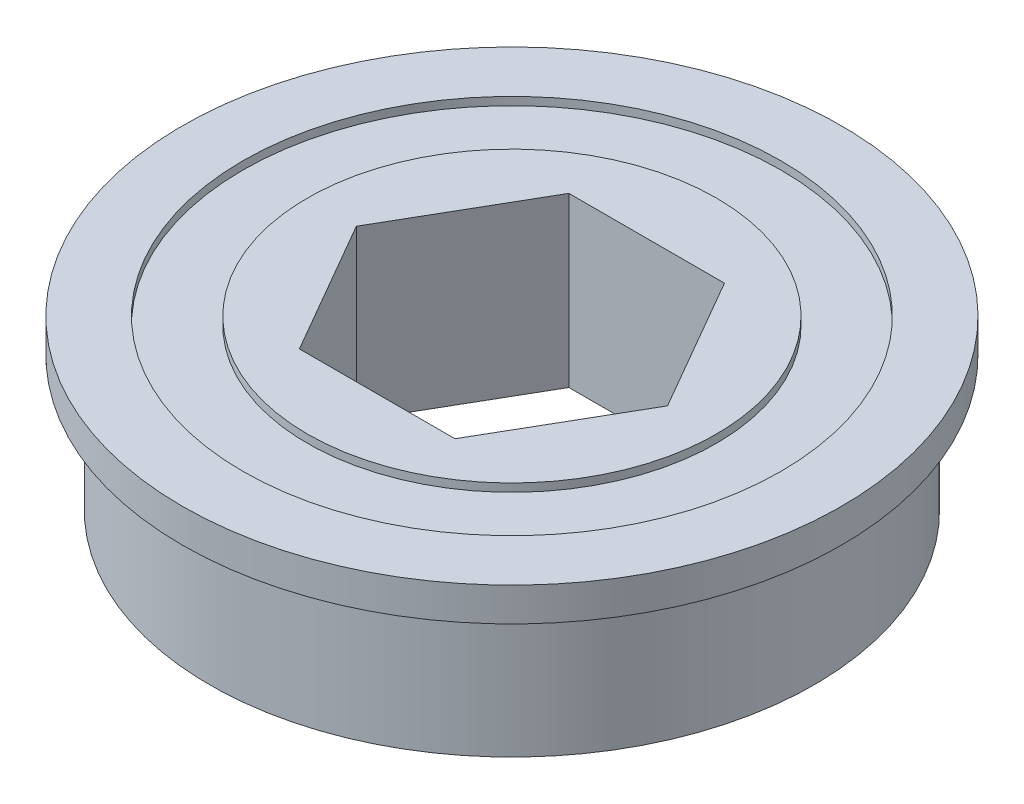
ISO-10303-21;
HEADER;
FILE_DESCRIPTION(('STEP AP214'),'2;1');
FILE_NAME('part.step','',(''),(''),'','','');
FILE_SCHEMA(('AUTOMOTIVE_DESIGN { 1 0 10303 214 1 1 1 1 }'));
ENDSEC;
DATA;
#1=APPLICATION_CONTEXT('core data for automotive mechanical design processes');
#2=APPLICATION_PROTOCOL_DEFINITION('international standard','automotive_design',2000,#1);
#3=PRODUCT_CONTEXT('',#1,'mechanical');
#4=PRODUCT('Part','Part','',(#3));
#5=PRODUCT_RELATED_PRODUCT_CATEGORY('part','',(#4));
#6=PRODUCT_DEFINITION_FORMATION('','',#4);
#7=PRODUCT_DEFINITION_CONTEXT('part definition',#1,'design');
#8=PRODUCT_DEFINITION('design','',#6,#7);
#9=PRODUCT_DEFINITION_SHAPE('','',#8);
#10=(LENGTH_UNIT() NAMED_UNIT(*) SI_UNIT(.MILLI.,.METRE.));
#11=(NAMED_UNIT(*) PLANE_ANGLE_UNIT() SI_UNIT($,.RADIAN.));
#12=(NAMED_UNIT(*) SI_UNIT($,.STERADIAN.) SOLID_ANGLE_UNIT());
#13=UNCERTAINTY_MEASURE_WITH_UNIT(LENGTH_MEASURE(1.E-05),#10,'distance_accuracy_value','');
#14=(GEOMETRIC_REPRESENTATION_CONTEXT(3) GLOBAL_UNCERTAINTY_ASSIGNED_CONTEXT((#13)) GLOBAL_UNIT_ASSIGNED_CONTEXT((#10,
#11,#12)) REPRESENTATION_CONTEXT('',''));
#15=CARTESIAN_POINT('',(0.,0.,0.));
#16=DIRECTION('',(0.,0.,1.));
#17=DIRECTION('',(1.,0.,0.));
#18=AXIS2_PLACEMENT_3D('',#15,#16,#17);
#19=CARTESIAN_POINT('',(0.,6.1,0.));
#20=DIRECTION('',(0.,1.,0.));
#21=DIRECTION('',(0.,0.,1.));
#22=AXIS2_PLACEMENT_3D('',#19,#20,#21);
#23=TOROIDAL_SURFACE('',#22,14.2748,0.25);
#24=CARTESIAN_POINT('',(0.,5.975,0.));
#25=DIRECTION('',(0.,-1.,0.));
#26=DIRECTION('',(0.,0.,-1.));
#27=AXIS2_PLACEMENT_3D('',#24,#25,#26);
#28=CIRCLE('',#27,14.0582936490539);
#29=CARTESIAN_POINT('',(0.,5.975,-14.0582936490539));
#30=VERTEX_POINT('',#29);
#31=EDGE_CURVE('E157',#30,#30,#28,.T.);
#32=ORIENTED_EDGE('',*,*,#31,.F.);
#33=EDGE_LOOP('',(#32));
#34=FACE_BOUND('',#33,.T.);
#35=CARTESIAN_POINT('',(0.,6.35,0.));
#36=DIRECTION('',(0.,1.,0.));
#37=DIRECTION('',(0.,0.,1.));
#38=AXIS2_PLACEMENT_3D('',#35,#36,#37);
#39=CIRCLE('',#38,14.2748);
#40=CARTESIAN_POINT('',(0.,6.35,14.2748));
#41=VERTEX_POINT('',#40);
#42=EDGE_CURVE('E169',#41,#41,#39,.T.);
#43=ORIENTED_EDGE('',*,*,#42,.F.);
#44=EDGE_LOOP('',(#43));
#45=FACE_BOUND('',#44,.T.);
#46=ADVANCED_FACE('F32',(#34,#45),#23,.F.);
#47=CARTESIAN_POINT('',(15.5575,6.35,0.));
#48=DIRECTION('',(0.,-1.,0.));
#49=DIRECTION('',(0.,0.,-1.));
#50=AXIS2_PLACEMENT_3D('',#47,#48,#49);
#51=PLANE('',#50);
#52=ORIENTED_EDGE('',*,*,#42,.T.);
#53=EDGE_LOOP('',(#52));
#54=FACE_BOUND('',#53,.T.);
#55=CARTESIAN_POINT('',(0.,6.35,0.));
#56=DIRECTION('',(0.,1.,0.));
#57=DIRECTION('',(0.,0.,1.));
#58=AXIS2_PLACEMENT_3D('',#55,#56,#57);
#59=CIRCLE('',#58,15.5575);
#60=CARTESIAN_POINT('',(0.,6.35,15.5575));
#61=VERTEX_POINT('',#60);
#62=EDGE_CURVE('E166',#61,#61,#59,.T.);
#63=ORIENTED_EDGE('',*,*,#62,.F.);
#64=EDGE_LOOP('',(#63));
#65=FACE_BOUND('',#64,.T.);
#66=ADVANCED_FACE('F209',(#54,#65),#51,.T.);
#67=CARTESIAN_POINT('',(0.,5.974975,0.));
#68=DIRECTION('',(0.,1.,0.));
#69=DIRECTION('',(0.,0.,1.));
#70=AXIS2_PLACEMENT_3D('',#67,#68,#69);
#71=CYLINDRICAL_SURFACE('',#70,15.5575);
#72=ORIENTED_EDGE('',*,*,#62,.T.);
#73=EDGE_LOOP('',(#72));
#74=FACE_BOUND('',#73,.T.);
#75=CARTESIAN_POINT('',(0.,7.9375,0.));
#76=DIRECTION('',(0.,1.,0.));
#77=DIRECTION('',(0.,0.,1.));
#78=AXIS2_PLACEMENT_3D('',#75,#76,#77);
#79=CIRCLE('',#78,15.5575);
#80=CARTESIAN_POINT('',(0.,7.9375,15.5575));
#81=VERTEX_POINT('',#80);
#82=EDGE_CURVE('E163',#81,#81,#79,.T.);
#83=ORIENTED_EDGE('',*,*,#82,.F.);
#84=EDGE_LOOP('',(#83));
#85=FACE_BOUND('',#84,.T.);
#86=ADVANCED_FACE('F214',(#74,#85),#71,.T.);
#87=CARTESIAN_POINT('',(0.,7.9375,0.));
#88=DIRECTION('',(0.,1.,0.));
#89=DIRECTION('',(0.,0.,1.));
#90=AXIS2_PLACEMENT_3D('',#87,#88,#89);
#91=PLANE('',#90);
#92=CARTESIAN_POINT('',(0.,7.9375,0.));
#93=DIRECTION('',(0.,1.,0.));
#94=DIRECTION('',(0.,0.,-1.));
#95=AXIS2_PLACEMENT_3D('',#92,#93,#94);
#96=CIRCLE('',#95,12.7);
#97=CARTESIAN_POINT('',(0.,7.9375,-12.7));
#98=VERTEX_POINT('',#97);
#99=EDGE_CURVE('E139',#98,#98,#96,.T.);
#100=ORIENTED_EDGE('',*,*,#99,.F.);
#101=EDGE_LOOP('',(#100));
#102=FACE_BOUND('',#101,.T.);
#103=ORIENTED_EDGE('',*,*,#82,.T.);
#104=EDGE_LOOP('',(#103));
#105=FACE_BOUND('',#104,.T.);
#106=ADVANCED_FACE('F203',(#102,#105),#91,.T.);
#107=CARTESIAN_POINT('',(0.,5.975,0.));
#108=DIRECTION('',(0.,-1.,0.));
#109=DIRECTION('',(0.,0.,-1.));
#110=AXIS2_PLACEMENT_3D('',#107,#108,#109);
#111=CONICAL_SURFACE('',#110,14.0582936490539,0.523598775598302);
#112=CARTESIAN_POINT('',(0.,5.6,0.));
#113=DIRECTION('',(0.,-1.,0.));
#114=DIRECTION('',(0.,0.,-1.));
#115=AXIS2_PLACEMENT_3D('',#112,#113,#114);
#116=CIRCLE('',#115,14.2748);
#117=CARTESIAN_POINT('',(0.,5.6,-14.2748));
#118=VERTEX_POINT('',#117);
#119=EDGE_CURVE('E160',#118,#118,#116,.T.);
#120=ORIENTED_EDGE('',*,*,#119,.F.);
#121=EDGE_LOOP('',(#120));
#122=FACE_BOUND('',#121,.T.);
#123=ORIENTED_EDGE('',*,*,#31,.T.);
#124=EDGE_LOOP('',(#123));
#125=FACE_BOUND('',#124,.T.);
#126=ADVANCED_FACE('F197',(#122,#125),#111,.T.);
#127=CARTESIAN_POINT('',(0.,0.,0.));
#128=DIRECTION('',(0.,1.,0.));
#129=DIRECTION('',(0.,0.,1.));
#130=AXIS2_PLACEMENT_3D('',#127,#128,#129);
#131=CYLINDRICAL_SURFACE('',#130,14.2748);
#132=CARTESIAN_POINT('',(0.,0.,0.));
#133=DIRECTION('',(0.,-1.,0.));
#134=DIRECTION('',(0.,0.,-1.));
#135=AXIS2_PLACEMENT_3D('',#132,#133,#134);
#136=CIRCLE('',#135,14.2748);
#137=CARTESIAN_POINT('',(0.,0.,-14.2748));
#138=VERTEX_POINT('',#137);
#139=EDGE_CURVE('E152',#138,#138,#136,.T.);
#140=ORIENTED_EDGE('',*,*,#139,.F.);
#141=EDGE_LOOP('',(#140));
#142=FACE_BOUND('',#141,.T.);
#143=ORIENTED_EDGE('',*,*,#119,.T.);
#144=EDGE_LOOP('',(#143));
#145=FACE_BOUND('',#144,.T.);
#146=ADVANCED_FACE('F191',(#142,#145),#131,.T.);
#147=CARTESIAN_POINT('',(0.,0.,0.));
#148=DIRECTION('',(0.,-1.,0.));
#149=DIRECTION('',(0.,0.,-1.));
#150=AXIS2_PLACEMENT_3D('',#147,#148,#149);
#151=PLANE('',#150);
#152=CARTESIAN_POINT('',(0.,0.,0.));
#153=DIRECTION('',(0.,-1.,0.));
#154=DIRECTION('',(0.,0.,1.));
#155=AXIS2_PLACEMENT_3D('',#152,#153,#154);
#156=CIRCLE('',#155,12.7);
#157=CARTESIAN_POINT('',(0.,0.,12.7));
#158=VERTEX_POINT('',#157);
#159=EDGE_CURVE('E148',#158,#158,#156,.T.);
#160=ORIENTED_EDGE('',*,*,#159,.F.);
#161=EDGE_LOOP('',(#160));
#162=FACE_BOUND('',#161,.T.);
#163=ORIENTED_EDGE('',*,*,#139,.T.);
#164=EDGE_LOOP('',(#163));
#165=FACE_BOUND('',#164,.T.);
#166=ADVANCED_FACE('F185',(#162,#165),#151,.T.);
#167=CARTESIAN_POINT('',(0.,0.381,0.));
#168=DIRECTION('',(0.,-1.,0.));
#169=DIRECTION('',(0.,0.,-1.));
#170=AXIS2_PLACEMENT_3D('',#167,#168,#169);
#171=CYLINDRICAL_SURFACE('',#170,12.7);
#172=CARTESIAN_POINT('',(0.,0.381,0.));
#173=DIRECTION('',(0.,-1.,0.));
#174=DIRECTION('',(0.,0.,1.));
#175=AXIS2_PLACEMENT_3D('',#172,#173,#174);
#176=CIRCLE('',#175,12.7);
#177=CARTESIAN_POINT('',(0.,0.381,12.7));
#178=VERTEX_POINT('',#177);
#179=EDGE_CURVE('E149',#178,#178,#176,.T.);
#180=ORIENTED_EDGE('',*,*,#179,.F.);
#181=EDGE_LOOP('',(#180));
#182=FACE_BOUND('',#181,.T.);
#183=ORIENTED_EDGE('',*,*,#159,.T.);
#184=EDGE_LOOP('',(#183));
#185=FACE_BOUND('',#184,.T.);
#186=ADVANCED_FACE('F179',(#182,#185),#171,.F.);
#187=CARTESIAN_POINT('',(0.,0.381,0.));
#188=DIRECTION('',(0.,1.,0.));
#189=DIRECTION('',(0.,0.,1.));
#190=AXIS2_PLACEMENT_3D('',#187,#188,#189);
#191=PLANE('',#190);
#192=CARTESIAN_POINT('',(0.,0.381,0.));
#193=DIRECTION('',(0.,1.,0.));
#194=DIRECTION('',(0.,0.,1.));
#195=AXIS2_PLACEMENT_3D('',#192,#193,#194);
#196=CIRCLE('',#195,9.652);
#197=CARTESIAN_POINT('',(0.,0.381,9.652));
#198=VERTEX_POINT('',#197);
#199=EDGE_CURVE('E39',#198,#198,#196,.F.);
#200=ORIENTED_EDGE('',*,*,#199,.F.);
#201=EDGE_LOOP('',(#200));
#202=FACE_BOUND('',#201,.T.);
#203=ORIENTED_EDGE('',*,*,#179,.T.);
#204=EDGE_LOOP('',(#203));
#205=FACE_BOUND('',#204,.T.);
#206=ADVANCED_FACE('F176',(#202,#205),#191,.F.);
#207=CARTESIAN_POINT('',(0.,0.,0.));
#208=DIRECTION('',(0.,1.,0.));
#209=DIRECTION('',(0.,0.,1.));
#210=AXIS2_PLACEMENT_3D('',#207,#208,#209);
#211=CYLINDRICAL_SURFACE('',#210,9.652);
#212=CARTESIAN_POINT('',(0.,0.,0.));
#213=DIRECTION('',(0.,-1.,0.));
#214=DIRECTION('',(0.,0.,-1.));
#215=AXIS2_PLACEMENT_3D('',#212,#213,#214);
#216=CIRCLE('',#215,9.652);
#217=CARTESIAN_POINT('',(0.,0.,-9.652));
#218=VERTEX_POINT('',#217);
#219=EDGE_CURVE('E143',#218,#218,#216,.T.);
#220=ORIENTED_EDGE('',*,*,#219,.F.);
#221=EDGE_LOOP('',(#220));
#222=FACE_BOUND('',#221,.T.);
#223=ORIENTED_EDGE('',*,*,#199,.T.);
#224=EDGE_LOOP('',(#223));
#225=FACE_BOUND('',#224,.T.);
#226=ADVANCED_FACE('F174',(#222,#225),#211,.T.);
#227=CARTESIAN_POINT('',(0.,0.,0.));
#228=DIRECTION('',(0.,-1.,0.));
#229=DIRECTION('',(0.,0.,-1.));
#230=AXIS2_PLACEMENT_3D('',#227,#228,#229);
#231=PLANE('',#230);
#232=DIRECTION('',(-0.5,0.,0.866025403784439));
#233=VECTOR('',#232,1.);
#234=CARTESIAN_POINT('',(-3.67194771204602,0.,-6.36));
#235=LINE('',#234,#233);
#236=CARTESIAN_POINT('',(-3.67194771204602,0.,-6.36));
#237=VERTEX_POINT('',#236);
#238=CARTESIAN_POINT('',(-7.34389542409204,0.,0.));
#239=VERTEX_POINT('',#238);
#240=EDGE_CURVE('E86',#237,#239,#235,.T.);
#241=ORIENTED_EDGE('',*,*,#240,.T.);
#242=DIRECTION('',(0.5,0.,0.866025403784439));
#243=VECTOR('',#242,1.);
#244=CARTESIAN_POINT('',(-7.34389542409204,0.,0.));
#245=LINE('',#244,#243);
#246=CARTESIAN_POINT('',(-3.67194771204602,0.,6.36));
#247=VERTEX_POINT('',#246);
#248=EDGE_CURVE('E95',#239,#247,#245,.T.);
#249=ORIENTED_EDGE('',*,*,#248,.T.);
#250=DIRECTION('',(1.,0.,0.));
#251=VECTOR('',#250,1.);
#252=CARTESIAN_POINT('',(-3.67194771204601,0.,6.36));
#253=LINE('',#252,#251);
#254=CARTESIAN_POINT('',(3.67194771204602,0.,6.36));
#255=VERTEX_POINT('',#254);
#256=EDGE_CURVE('E46',#247,#255,#253,.T.);
#257=ORIENTED_EDGE('',*,*,#256,.T.);
#258=DIRECTION('',(0.5,0.,-0.866025403784439));
#259=VECTOR('',#258,1.);
#260=CARTESIAN_POINT('',(3.67194771204602,0.,6.36));
#261=LINE('',#260,#259);
#262=CARTESIAN_POINT('',(7.34389542409204,0.,0.));
#263=VERTEX_POINT('',#262);
#264=EDGE_CURVE('E110',#255,#263,#261,.T.);
#265=ORIENTED_EDGE('',*,*,#264,.T.);
#266=DIRECTION('',(-0.5,0.,-0.866025403784439));
#267=VECTOR('',#266,1.);
#268=CARTESIAN_POINT('',(7.34389542409204,0.,0.));
#269=LINE('',#268,#267);
#270=CARTESIAN_POINT('',(3.67194771204602,0.,-6.36));
#271=VERTEX_POINT('',#270);
#272=EDGE_CURVE('E113',#263,#271,#269,.T.);
#273=ORIENTED_EDGE('',*,*,#272,.T.);
#274=DIRECTION('',(-1.,0.,0.));
#275=VECTOR('',#274,1.);
#276=CARTESIAN_POINT('',(3.67194771204602,0.,-6.36));
#277=LINE('',#276,#275);
#278=EDGE_CURVE('E92',#271,#237,#277,.T.);
#279=ORIENTED_EDGE('',*,*,#278,.T.);
#280=EDGE_LOOP('',(#241,#249,#257,#265,#273,#279));
#281=FACE_BOUND('',#280,.T.);
#282=ORIENTED_EDGE('',*,*,#219,.T.);
#283=EDGE_LOOP('',(#282));
#284=FACE_BOUND('',#283,.T.);
#285=ADVANCED_FACE('F99',(#281,#284),#231,.T.);
#286=CARTESIAN_POINT('',(0.,7.5565,0.));
#287=DIRECTION('',(0.,1.,0.));
#288=DIRECTION('',(0.,0.,1.));
#289=AXIS2_PLACEMENT_3D('',#286,#287,#288);
#290=CYLINDRICAL_SURFACE('',#289,12.7);
#291=CARTESIAN_POINT('',(0.,7.5565,0.));
#292=DIRECTION('',(0.,1.,0.));
#293=DIRECTION('',(0.,0.,-1.));
#294=AXIS2_PLACEMENT_3D('',#291,#292,#293);
#295=CIRCLE('',#294,12.7);
#296=CARTESIAN_POINT('',(0.,7.5565,-12.7));
#297=VERTEX_POINT('',#296);
#298=EDGE_CURVE('E140',#297,#297,#295,.T.);
#299=ORIENTED_EDGE('',*,*,#298,.F.);
#300=EDGE_LOOP('',(#299));
#301=FACE_BOUND('',#300,.T.);
#302=ORIENTED_EDGE('',*,*,#99,.T.);
#303=EDGE_LOOP('',(#302));
#304=FACE_BOUND('',#303,.T.);
#305=ADVANCED_FACE('F234',(#301,#304),#290,.F.);
#306=CARTESIAN_POINT('',(0.,7.5565,0.));
#307=DIRECTION('',(0.,-1.,0.));
#308=DIRECTION('',(0.,0.,-1.));
#309=AXIS2_PLACEMENT_3D('',#306,#307,#308);
#310=PLANE('',#309);
#311=CARTESIAN_POINT('',(0.,7.5565,0.));
#312=DIRECTION('',(0.,-1.,0.));
#313=DIRECTION('',(0.,0.,-1.));
#314=AXIS2_PLACEMENT_3D('',#311,#312,#313);
#315=CIRCLE('',#314,9.652);
#316=CARTESIAN_POINT('',(0.,7.5565,-9.652));
#317=VERTEX_POINT('',#316);
#318=EDGE_CURVE('E11',#317,#317,#315,.F.);
#319=ORIENTED_EDGE('',*,*,#318,.F.);
#320=EDGE_LOOP('',(#319));
#321=FACE_BOUND('',#320,.T.);
#322=ORIENTED_EDGE('',*,*,#298,.T.);
#323=EDGE_LOOP('',(#322));
#324=FACE_BOUND('',#323,.T.);
#325=ADVANCED_FACE('F237',(#321,#324),#310,.F.);
#326=CARTESIAN_POINT('',(0.,7.9375,0.));
#327=DIRECTION('',(0.,-1.,0.));
#328=DIRECTION('',(0.,0.,-1.));
#329=AXIS2_PLACEMENT_3D('',#326,#327,#328);
#330=CYLINDRICAL_SURFACE('',#329,9.652);
#331=CARTESIAN_POINT('',(0.,7.9375,0.));
#332=DIRECTION('',(0.,1.,0.));
#333=DIRECTION('',(0.,0.,1.));
#334=AXIS2_PLACEMENT_3D('',#331,#332,#333);
#335=CIRCLE('',#334,9.652);
#336=CARTESIAN_POINT('',(0.,7.9375,9.652));
#337=VERTEX_POINT('',#336);
#338=EDGE_CURVE('E129',#337,#337,#335,.T.);
#339=ORIENTED_EDGE('',*,*,#338,.F.);
#340=EDGE_LOOP('',(#339));
#341=FACE_BOUND('',#340,.T.);
#342=ORIENTED_EDGE('',*,*,#318,.T.);
#343=EDGE_LOOP('',(#342));
#344=FACE_BOUND('',#343,.T.);
#345=ADVANCED_FACE('F241',(#341,#344),#330,.T.);
#346=CARTESIAN_POINT('',(0.,7.9375,0.));
#347=DIRECTION('',(0.,1.,0.));
#348=DIRECTION('',(0.,0.,1.));
#349=AXIS2_PLACEMENT_3D('',#346,#347,#348);
#350=PLANE('',#349);
#351=DIRECTION('',(-0.5,0.,0.866025403784439));
#352=VECTOR('',#351,1.);
#353=CARTESIAN_POINT('',(-3.67194771204602,7.9375,-6.36));
#354=LINE('',#353,#352);
#355=CARTESIAN_POINT('',(-3.67194771204602,7.9375,-6.36));
#356=VERTEX_POINT('',#355);
#357=CARTESIAN_POINT('',(-7.34389542409204,7.9375,0.));
#358=VERTEX_POINT('',#357);
#359=EDGE_CURVE('E54',#356,#358,#354,.T.);
#360=ORIENTED_EDGE('',*,*,#359,.F.);
#361=DIRECTION('',(-1.,0.,0.));
#362=VECTOR('',#361,1.);
#363=CARTESIAN_POINT('',(3.67194771204602,7.9375,-6.36));
#364=LINE('',#363,#362);
#365=CARTESIAN_POINT('',(3.67194771204602,7.9375,-6.36));
#366=VERTEX_POINT('',#365);
#367=EDGE_CURVE('E103',#366,#356,#364,.T.);
#368=ORIENTED_EDGE('',*,*,#367,.F.);
#369=DIRECTION('',(-0.5,0.,-0.866025403784439));
#370=VECTOR('',#369,1.);
#371=CARTESIAN_POINT('',(7.34389542409204,7.9375,0.));
#372=LINE('',#371,#370);
#373=CARTESIAN_POINT('',(7.34389542409204,7.9375,0.));
#374=VERTEX_POINT('',#373);
#375=EDGE_CURVE('E106',#374,#366,#372,.T.);
#376=ORIENTED_EDGE('',*,*,#375,.F.);
#377=DIRECTION('',(0.5,0.,-0.866025403784439));
#378=VECTOR('',#377,1.);
#379=CARTESIAN_POINT('',(3.67194771204602,7.9375,6.36));
#380=LINE('',#379,#378);
#381=CARTESIAN_POINT('',(3.67194771204602,7.9375,6.36));
#382=VERTEX_POINT('',#381);
#383=EDGE_CURVE('E122',#382,#374,#380,.T.);
#384=ORIENTED_EDGE('',*,*,#383,.F.);
#385=DIRECTION('',(1.,0.,0.));
#386=VECTOR('',#385,1.);
#387=CARTESIAN_POINT('',(-3.67194771204601,7.9375,6.36));
#388=LINE('',#387,#386);
#389=CARTESIAN_POINT('',(-3.67194771204601,7.9375,6.36));
#390=VERTEX_POINT('',#389);
#391=EDGE_CURVE('E119',#390,#382,#388,.T.);
#392=ORIENTED_EDGE('',*,*,#391,.F.);
#393=DIRECTION('',(0.5,0.,0.866025403784439));
#394=VECTOR('',#393,1.);
#395=CARTESIAN_POINT('',(-7.34389542409204,7.9375,0.));
#396=LINE('',#395,#394);
#397=EDGE_CURVE('E117',#358,#390,#396,.T.);
#398=ORIENTED_EDGE('',*,*,#397,.F.);
#399=EDGE_LOOP('',(#360,#368,#376,#384,#392,#398));
#400=FACE_BOUND('',#399,.T.);
#401=ORIENTED_EDGE('',*,*,#338,.T.);
#402=EDGE_LOOP('',(#401));
#403=FACE_BOUND('',#402,.T.);
#404=ADVANCED_FACE('F245',(#400,#403),#350,.T.);
#405=CARTESIAN_POINT('',(-3.67194771204602,0.,-6.36));
#406=DIRECTION('',(-0.866025403784439,0.,-0.499999999999999));
#407=DIRECTION('',(-0.5,0.,0.866025403784439));
#408=AXIS2_PLACEMENT_3D('',#405,#406,#407);
#409=PLANE('',#408);
#410=ORIENTED_EDGE('',*,*,#359,.T.);
#411=DIRECTION('',(0.,1.,0.));
#412=VECTOR('',#411,1.);
#413=CARTESIAN_POINT('',(-7.34389542409204,0.,0.));
#414=LINE('',#413,#412);
#415=EDGE_CURVE('E82',#239,#358,#414,.T.);
#416=ORIENTED_EDGE('',*,*,#415,.F.);
#417=ORIENTED_EDGE('',*,*,#240,.F.);
#418=DIRECTION('',(0.,1.,0.));
#419=VECTOR('',#418,1.);
#420=CARTESIAN_POINT('',(-3.67194771204602,0.,-6.36));
#421=LINE('',#420,#419);
#422=EDGE_CURVE('E127',#237,#356,#421,.T.);
#423=ORIENTED_EDGE('',*,*,#422,.T.);
#424=EDGE_LOOP('',(#410,#416,#417,#423));
#425=FACE_BOUND('',#424,.T.);
#426=ADVANCED_FACE('F84',(#425),#409,.F.);
#427=CARTESIAN_POINT('',(3.67194771204602,0.,-6.36));
#428=DIRECTION('',(0.,0.,-1.));
#429=DIRECTION('',(-1.,0.,0.));
#430=AXIS2_PLACEMENT_3D('',#427,#428,#429);
#431=PLANE('',#430);
#432=ORIENTED_EDGE('',*,*,#367,.T.);
#433=ORIENTED_EDGE('',*,*,#422,.F.);
#434=ORIENTED_EDGE('',*,*,#278,.F.);
#435=DIRECTION('',(0.,1.,0.));
#436=VECTOR('',#435,1.);
#437=CARTESIAN_POINT('',(3.67194771204602,0.,-6.36));
#438=LINE('',#437,#436);
#439=EDGE_CURVE('E130',#271,#366,#438,.T.);
#440=ORIENTED_EDGE('',*,*,#439,.T.);
#441=EDGE_LOOP('',(#432,#433,#434,#440));
#442=FACE_BOUND('',#441,.T.);
#443=ADVANCED_FACE('F252',(#442),#431,.F.);
#444=CARTESIAN_POINT('',(7.34389542409204,0.,0.));
#445=DIRECTION('',(0.866025403784439,0.,-0.5));
#446=DIRECTION('',(-0.5,0.,-0.866025403784439));
#447=AXIS2_PLACEMENT_3D('',#444,#445,#446);
#448=PLANE('',#447);
#449=ORIENTED_EDGE('',*,*,#375,.T.);
#450=ORIENTED_EDGE('',*,*,#439,.F.);
#451=ORIENTED_EDGE('',*,*,#272,.F.);
#452=DIRECTION('',(0.,1.,0.));
#453=VECTOR('',#452,1.);
#454=CARTESIAN_POINT('',(7.34389542409204,0.,0.));
#455=LINE('',#454,#453);
#456=EDGE_CURVE('E132',#263,#374,#455,.T.);
#457=ORIENTED_EDGE('',*,*,#456,.T.);
#458=EDGE_LOOP('',(#449,#450,#451,#457));
#459=FACE_BOUND('',#458,.T.);
#460=ADVANCED_FACE('F261',(#459),#448,.F.);
#461=CARTESIAN_POINT('',(3.67194771204602,0.,6.36));
#462=DIRECTION('',(0.866025403784439,0.,0.5));
#463=DIRECTION('',(0.5,0.,-0.866025403784439));
#464=AXIS2_PLACEMENT_3D('',#461,#462,#463);
#465=PLANE('',#464);
#466=ORIENTED_EDGE('',*,*,#383,.T.);
#467=ORIENTED_EDGE('',*,*,#456,.F.);
#468=ORIENTED_EDGE('',*,*,#264,.F.);
#469=DIRECTION('',(0.,1.,0.));
#470=VECTOR('',#469,1.);
#471=CARTESIAN_POINT('',(3.67194771204602,0.,6.36));
#472=LINE('',#471,#470);
#473=EDGE_CURVE('E134',#255,#382,#472,.T.);
#474=ORIENTED_EDGE('',*,*,#473,.T.);
#475=EDGE_LOOP('',(#466,#467,#468,#474));
#476=FACE_BOUND('',#475,.T.);
#477=ADVANCED_FACE('F258',(#476),#465,.F.);
#478=CARTESIAN_POINT('',(-3.67194771204601,0.,6.36));
#479=DIRECTION('',(0.,0.,1.));
#480=DIRECTION('',(1.,0.,0.));
#481=AXIS2_PLACEMENT_3D('',#478,#479,#480);
#482=PLANE('',#481);
#483=ORIENTED_EDGE('',*,*,#391,.T.);
#484=ORIENTED_EDGE('',*,*,#473,.F.);
#485=ORIENTED_EDGE('',*,*,#256,.F.);
#486=DIRECTION('',(0.,1.,0.));
#487=VECTOR('',#486,1.);
#488=CARTESIAN_POINT('',(-3.67194771204601,0.,6.36));
#489=LINE('',#488,#487);
#490=EDGE_CURVE('E91',#247,#390,#489,.T.);
#491=ORIENTED_EDGE('',*,*,#490,.T.);
#492=EDGE_LOOP('',(#483,#484,#485,#491));
#493=FACE_BOUND('',#492,.T.);
#494=ADVANCED_FACE('F255',(#493),#482,.F.);
#495=CARTESIAN_POINT('',(-7.34389542409204,0.,0.));
#496=DIRECTION('',(-0.866025403784439,0.,0.5));
#497=DIRECTION('',(0.5,0.,0.866025403784439));
#498=AXIS2_PLACEMENT_3D('',#495,#496,#497);
#499=PLANE('',#498);
#500=ORIENTED_EDGE('',*,*,#397,.T.);
#501=ORIENTED_EDGE('',*,*,#490,.F.);
#502=ORIENTED_EDGE('',*,*,#248,.F.);
#503=ORIENTED_EDGE('',*,*,#415,.T.);
#504=EDGE_LOOP('',(#500,#501,#502,#503));
#505=FACE_BOUND('',#504,.T.);
#506=ADVANCED_FACE('F96',(#505),#499,.F.);
#507=CLOSED_SHELL('',(#46,#66,#86,#106,#126,#146,#166,#186,#206,#226,#285,#305,#325,#345,#404,
#426,#443,#460,#477,#494,#506));
#508=MANIFOLD_SOLID_BREP('B2',#507);
#509=ADVANCED_BREP_SHAPE_REPRESENTATION('',(#18,#508),#14);
#510=SHAPE_DEFINITION_REPRESENTATION(#9,#509);
ENDSEC;
END-ISO-10303-21;
